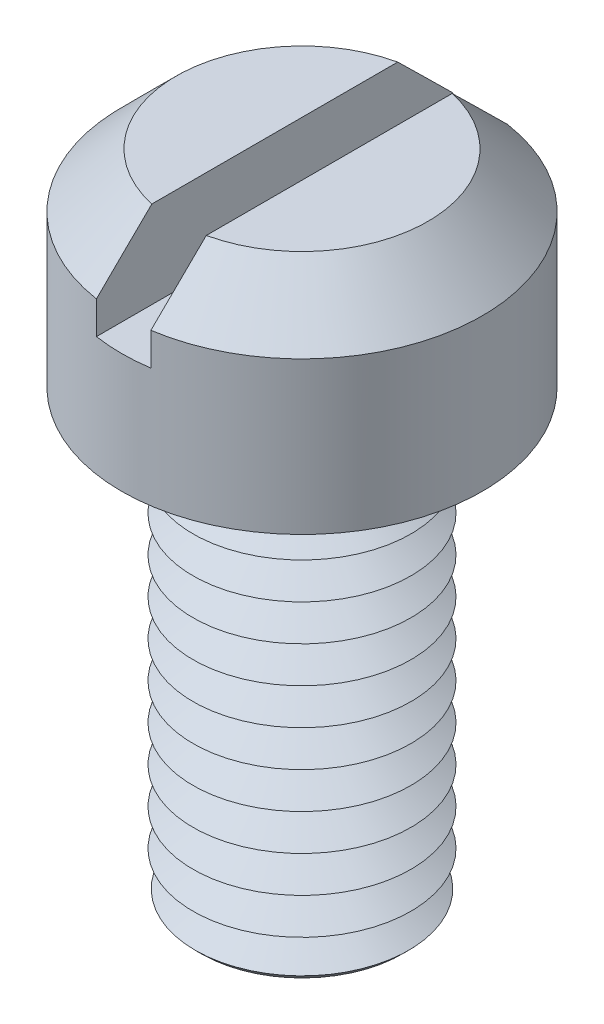
ISO-10303-21;
HEADER;
FILE_DESCRIPTION(('STEP AP214'),'2;1');
FILE_NAME('part.step','',(''),(''),'','','');
FILE_SCHEMA(('AUTOMOTIVE_DESIGN { 1 0 10303 214 1 1 1 1 }'));
ENDSEC;
DATA;
#1=APPLICATION_CONTEXT('core data for automotive mechanical design processes');
#2=APPLICATION_PROTOCOL_DEFINITION('international standard','automotive_design',2000,#1);
#3=PRODUCT_CONTEXT('',#1,'mechanical');
#4=PRODUCT('Part','Part','',(#3));
#5=PRODUCT_RELATED_PRODUCT_CATEGORY('part','',(#4));
#6=PRODUCT_DEFINITION_FORMATION('','',#4);
#7=PRODUCT_DEFINITION_CONTEXT('part definition',#1,'design');
#8=PRODUCT_DEFINITION('design','',#6,#7);
#9=PRODUCT_DEFINITION_SHAPE('','',#8);
#10=(LENGTH_UNIT() NAMED_UNIT(*) SI_UNIT(.MILLI.,.METRE.));
#11=(NAMED_UNIT(*) PLANE_ANGLE_UNIT() SI_UNIT($,.RADIAN.));
#12=(NAMED_UNIT(*) SI_UNIT($,.STERADIAN.) SOLID_ANGLE_UNIT());
#13=UNCERTAINTY_MEASURE_WITH_UNIT(LENGTH_MEASURE(1.E-05),#10,'distance_accuracy_value','');
#14=(GEOMETRIC_REPRESENTATION_CONTEXT(3) GLOBAL_UNCERTAINTY_ASSIGNED_CONTEXT((#13)) GLOBAL_UNIT_ASSIGNED_CONTEXT((#10,
#11,#12)) REPRESENTATION_CONTEXT('',''));
#15=CARTESIAN_POINT('',(0.,0.,0.));
#16=DIRECTION('',(0.,0.,1.));
#17=DIRECTION('',(1.,0.,0.));
#18=AXIS2_PLACEMENT_3D('',#15,#16,#17);
#19=CARTESIAN_POINT('',(0.880871999999996,1.444752,0.));
#20=DIRECTION('',(0.,1.,0.));
#21=DIRECTION('',(0.,0.,1.));
#22=AXIS2_PLACEMENT_3D('',#19,#20,#21);
#23=PLANE('',#22);
#24=DIRECTION('',(0.,0.,1.));
#25=VECTOR('',#24,1.);
#26=CARTESIAN_POINT('',(-0.1905,1.444752,-16.0764816511119));
#27=LINE('',#26,#25);
#28=CARTESIAN_POINT('',(-0.1905,1.444752,-0.860026296332847));
#29=VERTEX_POINT('',#28);
#30=CARTESIAN_POINT('',(-0.1905,1.444752,0.860026296332847));
#31=VERTEX_POINT('',#30);
#32=EDGE_CURVE('E86',#29,#31,#27,.T.);
#33=ORIENTED_EDGE('',*,*,#32,.F.);
#34=CARTESIAN_POINT('',(0.,1.444752,0.));
#35=DIRECTION('',(0.,-1.,0.));
#36=DIRECTION('',(0.,0.,-1.));
#37=AXIS2_PLACEMENT_3D('',#34,#35,#36);
#38=CIRCLE('',#37,0.880871999999996);
#39=EDGE_CURVE('E95',#31,#29,#38,.T.);
#40=ORIENTED_EDGE('',*,*,#39,.F.);
#41=EDGE_LOOP('',(#33,#40));
#42=FACE_BOUND('',#41,.T.);
#43=ADVANCED_FACE('F32',(#42),#23,.T.);
#44=CARTESIAN_POINT('',(0.,1.063752,0.));
#45=DIRECTION('',(0.,-1.,0.));
#46=DIRECTION('',(0.,0.,-1.));
#47=AXIS2_PLACEMENT_3D('',#44,#45,#46);
#48=CONICAL_SURFACE('',#47,1.261872,0.785398163397455);
#49=CARTESIAN_POINT('',(-0.1905,-0.467852623185187,-2.78697351876229));
#50=CARTESIAN_POINT('',(-0.1905,-0.371740082854874,-2.69063483874218));
#51=CARTESIAN_POINT('',(-0.1905,-0.275637399117228,-2.59428631466473));
#52=CARTESIAN_POINT('',(-0.1905,-0.0834624386961863,-2.40155440098031));
#53=CARTESIAN_POINT('',(-0.1905,0.0126098372138024,-2.3051710106022));
#54=CARTESIAN_POINT('',(-0.1905,0.204760774886571,-2.11230651513949));
#55=CARTESIAN_POINT('',(-0.1905,0.300839411910062,-2.01582538540597));
#56=CARTESIAN_POINT('',(-0.1905,0.492925197846268,-1.82279638627984));
#57=CARTESIAN_POINT('',(-0.1905,0.588932348356453,-1.72624851847759));
#58=CARTESIAN_POINT('',(-0.1905,0.781174131880335,-1.53269742629837));
#59=CARTESIAN_POINT('',(-0.1905,0.877408362403364,-1.4356938022126));
#60=CARTESIAN_POINT('',(-0.1905,1.06968632728043,-1.24148458714));
#61=CARTESIAN_POINT('',(-0.1905,1.1657300483249,-1.14427898295068));
#62=CARTESIAN_POINT('',(-0.1905,1.30946572978111,-0.998178595895962));
#63=CARTESIAN_POINT('',(-0.1905,1.35731451546988,-0.94943813306983));
#64=CARTESIAN_POINT('',(-0.1905,1.452847816913,-0.851793511017332));
#65=CARTESIAN_POINT('',(-0.1905,1.50053232819034,-0.802889347400097));
#66=CARTESIAN_POINT('',(-0.1905,1.59561548585213,-0.704816057706284));
#67=CARTESIAN_POINT('',(-0.1905,1.64301416722832,-0.6556469655179));
#68=CARTESIAN_POINT('',(-0.1905,1.73730670086978,-0.556827683778257));
#69=CARTESIAN_POINT('',(-0.1905,1.78420058313534,-0.507177523153933));
#70=CARTESIAN_POINT('',(-0.1905,1.84311872197408,-0.44333618835412));
#71=CARTESIAN_POINT('',(-0.1905,1.85567871539395,-0.429640631358191));
#72=CARTESIAN_POINT('',(-0.1905,1.88068026638353,-0.402141140539372));
#73=CARTESIAN_POINT('',(-0.1905,1.89312182039946,-0.388337203487076));
#74=CARTESIAN_POINT('',(-0.1905,1.93023876803364,-0.34669983128792));
#75=CARTESIAN_POINT('',(-0.1905,1.95468666777254,-0.318662068489018));
#76=CARTESIAN_POINT('',(-0.1905,1.99780726369237,-0.267088632360702));
#77=CARTESIAN_POINT('',(-0.1905,2.0166843364472,-0.243727705601058));
#78=CARTESIAN_POINT('',(-0.1905,2.04382713383034,-0.207795925782311));
#79=CARTESIAN_POINT('',(-0.1905,2.0526786384746,-0.195671219363639));
#80=CARTESIAN_POINT('',(-0.1905,2.06978239978055,-0.171009364845747));
#81=CARTESIAN_POINT('',(-0.1905,2.07803495870436,-0.158472429488246));
#82=CARTESIAN_POINT('',(-0.1905,2.09357374360952,-0.132891355377702));
#83=CARTESIAN_POINT('',(-0.1905,2.10086472451894,-0.119850159205719));
#84=CARTESIAN_POINT('',(-0.1905,2.11394801108239,-0.0930224341203741));
#85=CARTESIAN_POINT('',(-0.1905,2.11974244648433,-0.0792369985224974));
#86=CARTESIAN_POINT('',(-0.1905,2.12789755844528,-0.0539834572929784));
#87=CARTESIAN_POINT('',(-0.1905,2.13073382736757,-0.0426753846272729));
#88=CARTESIAN_POINT('',(-0.1905,2.13443330250219,-0.0197541392729509));
#89=CARTESIAN_POINT('',(-0.1905,2.13530223027439,-0.00814195093503864));
#90=CARTESIAN_POINT('',(-0.1905,2.13488284360986,0.0150669074323507));
#91=CARTESIAN_POINT('',(-0.1905,2.13358965136658,0.0266634831429294));
#92=CARTESIAN_POINT('',(-0.1905,2.12912122269932,0.0494949413611823));
#93=CARTESIAN_POINT('',(-0.1905,2.12594129340789,0.0607288480881517));
#94=CARTESIAN_POINT('',(-0.1905,2.11764355432097,0.0842906430777095));
#95=CARTESIAN_POINT('',(-0.1905,2.11231111853573,0.0965399148168696));
#96=CARTESIAN_POINT('',(-0.1905,2.10047062247971,0.120466218396629));
#97=CARTESIAN_POINT('',(-0.1905,2.09396013240869,0.132142002891485));
#98=CARTESIAN_POINT('',(-0.1905,2.08012181066479,0.15513217072478));
#99=CARTESIAN_POINT('',(-0.1905,2.07278723907617,0.1664424279402));
#100=CARTESIAN_POINT('',(-0.1905,2.05761083764235,0.18869648097471));
#101=CARTESIAN_POINT('',(-0.1905,2.0497695155635,0.199640627444946));
#102=CARTESIAN_POINT('',(-0.1905,2.0240870467418,0.234295618484728));
#103=CARTESIAN_POINT('',(-0.1905,2.00557686391405,0.257506873432943));
#104=CARTESIAN_POINT('',(-0.1905,1.96772808818959,0.303247770205183));
#105=CARTESIAN_POINT('',(-0.1905,1.94838901808858,0.325777006291657));
#106=CARTESIAN_POINT('',(-0.1905,1.90920204904368,0.370448767266621));
#107=CARTESIAN_POINT('',(-0.1905,1.88935342326154,0.392590654224217));
#108=CARTESIAN_POINT('',(-0.1905,1.849357449373,0.436603538248994));
#109=CARTESIAN_POINT('',(-0.1905,1.82921008396243,0.458474519488523));
#110=CARTESIAN_POINT('',(-0.1905,1.76867411875994,0.523605941585183));
#111=CARTESIAN_POINT('',(-0.1905,1.7279989891194,0.566599664221069));
#112=CARTESIAN_POINT('',(-0.1905,1.64630634339145,0.652179064601015));
#113=CARTESIAN_POINT('',(-0.1905,1.60528919422022,0.694765095016984));
#114=CARTESIAN_POINT('',(-0.1905,1.48062528473734,0.823537408540982));
#115=CARTESIAN_POINT('',(-0.1905,1.39663943833997,0.909395179579613));
#116=CARTESIAN_POINT('',(-0.1905,1.22831055112411,1.08076125334498));
#117=CARTESIAN_POINT('',(-0.1905,1.14396750329919,1.16626954915158));
#118=CARTESIAN_POINT('',(-0.1905,0.97504815331309,1.3371360598749));
#119=CARTESIAN_POINT('',(-0.1905,0.890471759299012,1.42249418407891));
#120=CARTESIAN_POINT('',(-0.1905,0.721209031224259,1.59309992339054));
#121=CARTESIAN_POINT('',(-0.1905,0.636522698009183,1.67834753933818));
#122=CARTESIAN_POINT('',(-0.1905,0.38199959253074,1.93435685604841));
#123=CARTESIAN_POINT('',(-0.1905,0.212062079716812,2.10501838986477));
#124=CARTESIAN_POINT('',(-0.1905,-0.127865722950066,2.4461133115385));
#125=CARTESIAN_POINT('',(-0.1905,-0.297855940232423,2.61654677170018));
#126=CARTESIAN_POINT('',(-0.1905,-0.467852623185187,2.78697351876229));
#127=B_SPLINE_CURVE_WITH_KNOTS('',3,(#49,#50,#51,#52,#53,#54,#55,#56,#57,#58,#59,#60,#61,#62,
#63,#64,#65,#66,#67,#68,#69,#70,#71,#72,#73,#74,#75,#76,#77,#78,#79,#80,#81,#82,#83,#84,#85,#86,
#87,#88,#89,#90,#91,#92,#93,#94,#95,#96,#97,#98,#99,#100,#101,#102,#103,#104,#105,#106,#107,
#108,#109,#110,#111,#112,#113,#114,#115,#116,#117,#118,#119,#120,#121,#122,#123,#124,#125,#126),
.UNSPECIFIED.,.F.,.F.,(4,2,2,2,2,2,2,2,2,2,2,2,2,2,2,2,2,2,2,2,2,2,2,2,2,2,2,2,2,2,2,2,2,2,2,2,
2,2,4),(0.,0.408250982112575,0.81651162552519,1.2249934536602,1.63346586193545,2.04338845827448,
2.45333874979418,2.65824408057358,2.86315495219124,3.06804020717027,3.27291321780224,
3.32866110441279,3.38441065849898,3.49599680772364,3.58605970327152,3.6310843329022,
3.67608608022715,3.72085621193336,3.76556227534564,3.80040171130422,3.83513969389775,
3.86995615220096,3.90485957441739,3.94484090250556,3.98490565421372,4.02532591276218,
4.06570627982171,4.15472209103738,4.24378985723537,4.33299263035048,4.42220059078114,
4.59975102371055,4.77713069623443,5.13744128581211,5.49775897583519,5.85824802150938,
6.21873431070841,6.94125546884615,7.66340351873644),.UNSPECIFIED.);
#128=CARTESIAN_POINT('',(-0.1905,1.063752,-1.24740959367162));
#129=VERTEX_POINT('',#128);
#130=EDGE_CURVE('E83',#129,#29,#127,.T.);
#131=ORIENTED_EDGE('',*,*,#130,.F.);
#132=CARTESIAN_POINT('',(0.,1.063752,0.));
#133=DIRECTION('',(0.,-1.,0.));
#134=DIRECTION('',(0.,0.,-1.));
#135=AXIS2_PLACEMENT_3D('',#132,#133,#134);
#136=CIRCLE('',#135,1.261872);
#137=CARTESIAN_POINT('',(-0.1905,1.063752,1.24740959367162));
#138=VERTEX_POINT('',#137);
#139=EDGE_CURVE('E101',#138,#129,#136,.T.);
#140=ORIENTED_EDGE('',*,*,#139,.F.);
#141=EDGE_CURVE('E92',#31,#138,#127,.T.);
#142=ORIENTED_EDGE('',*,*,#141,.F.);
#143=ORIENTED_EDGE('',*,*,#39,.T.);
#144=EDGE_LOOP('',(#131,#140,#142,#143));
#145=FACE_BOUND('',#144,.T.);
#146=ADVANCED_FACE('F97',(#145),#48,.T.);
#147=CARTESIAN_POINT('',(0.,-2.921,0.));
#148=DIRECTION('',(0.,-1.,0.));
#149=DIRECTION('',(0.,0.,-1.));
#150=AXIS2_PLACEMENT_3D('',#147,#148,#149);
#151=CONICAL_SURFACE('',#150,0.542029547438752,1.04719755119659);
#152=CARTESIAN_POINT('',(0.,-3.03870295474388,0.));
#153=DIRECTION('',(0.,-1.,0.));
#154=DIRECTION('',(0.,0.,-1.));
#155=AXIS2_PLACEMENT_3D('',#152,#153,#154);
#156=CIRCLE('',#155,0.745897045256123);
#157=CARTESIAN_POINT('',(0.,-3.03870295474388,-0.745897045256123));
#158=VERTEX_POINT('',#157);
#159=EDGE_CURVE('E187',#158,#158,#156,.F.);
#160=ORIENTED_EDGE('',*,*,#159,.T.);
#161=EDGE_LOOP('',(#160));
#162=FACE_BOUND('',#161,.T.);
#163=CARTESIAN_POINT('',(0.,-2.921,0.));
#164=DIRECTION('',(0.,-1.,0.));
#165=DIRECTION('',(0.,0.,-1.));
#166=AXIS2_PLACEMENT_3D('',#163,#164,#165);
#167=CIRCLE('',#166,0.542029547438752);
#168=CARTESIAN_POINT('',(0.,-2.921,-0.542029547438752));
#169=VERTEX_POINT('',#168);
#170=EDGE_CURVE('E181',#169,#169,#167,.T.);
#171=ORIENTED_EDGE('',*,*,#170,.T.);
#172=EDGE_LOOP('',(#171));
#173=FACE_BOUND('',#172,.T.);
#174=ADVANCED_FACE('F225',(#162,#173),#151,.T.);
#175=CARTESIAN_POINT('',(0.,-2.794,0.));
#176=DIRECTION('',(0.,1.,0.));
#177=DIRECTION('',(0.,0.,1.));
#178=AXIS2_PLACEMENT_3D('',#175,#176,#177);
#179=CONICAL_SURFACE('',#178,0.761999999999999,1.04719755119661);
#180=ORIENTED_EDGE('',*,*,#170,.F.);
#181=EDGE_LOOP('',(#180));
#182=FACE_BOUND('',#181,.T.);
#183=CARTESIAN_POINT('',(0.,-2.794,0.));
#184=DIRECTION('',(0.,-1.,0.));
#185=DIRECTION('',(0.,0.,-1.));
#186=AXIS2_PLACEMENT_3D('',#183,#184,#185);
#187=CIRCLE('',#186,0.761999999999999);
#188=CARTESIAN_POINT('',(0.,-2.794,-0.761999999999999));
#189=VERTEX_POINT('',#188);
#190=EDGE_CURVE('E178',#189,#189,#187,.T.);
#191=ORIENTED_EDGE('',*,*,#190,.T.);
#192=EDGE_LOOP('',(#191));
#193=FACE_BOUND('',#192,.T.);
#194=ADVANCED_FACE('F549',(#182,#193),#179,.T.);
#195=CARTESIAN_POINT('',(0.,-2.667,0.));
#196=DIRECTION('',(0.,-1.,0.));
#197=DIRECTION('',(0.,0.,-1.));
#198=AXIS2_PLACEMENT_3D('',#195,#196,#197);
#199=CONICAL_SURFACE('',#198,0.542029547438752,1.04719755119659);
#200=ORIENTED_EDGE('',*,*,#190,.F.);
#201=EDGE_LOOP('',(#200));
#202=FACE_BOUND('',#201,.T.);
#203=CARTESIAN_POINT('',(0.,-2.667,0.));
#204=DIRECTION('',(0.,-1.,0.));
#205=DIRECTION('',(0.,0.,-1.));
#206=AXIS2_PLACEMENT_3D('',#203,#204,#205);
#207=CIRCLE('',#206,0.542029547438752);
#208=CARTESIAN_POINT('',(0.,-2.667,-0.542029547438752));
#209=VERTEX_POINT('',#208);
#210=EDGE_CURVE('E175',#209,#209,#207,.T.);
#211=ORIENTED_EDGE('',*,*,#210,.T.);
#212=EDGE_LOOP('',(#211));
#213=FACE_BOUND('',#212,.T.);
#214=ADVANCED_FACE('F539',(#202,#213),#199,.T.);
#215=CARTESIAN_POINT('',(0.,-2.54,0.));
#216=DIRECTION('',(0.,1.,0.));
#217=DIRECTION('',(0.,0.,1.));
#218=AXIS2_PLACEMENT_3D('',#215,#216,#217);
#219=CONICAL_SURFACE('',#218,0.761999999999999,1.04719755119659);
#220=ORIENTED_EDGE('',*,*,#210,.F.);
#221=EDGE_LOOP('',(#220));
#222=FACE_BOUND('',#221,.T.);
#223=CARTESIAN_POINT('',(0.,-2.54,0.));
#224=DIRECTION('',(0.,-1.,0.));
#225=DIRECTION('',(0.,0.,-1.));
#226=AXIS2_PLACEMENT_3D('',#223,#224,#225);
#227=CIRCLE('',#226,0.761999999999999);
#228=CARTESIAN_POINT('',(0.,-2.54,-0.761999999999999));
#229=VERTEX_POINT('',#228);
#230=EDGE_CURVE('E172',#229,#229,#227,.T.);
#231=ORIENTED_EDGE('',*,*,#230,.T.);
#232=EDGE_LOOP('',(#231));
#233=FACE_BOUND('',#232,.T.);
#234=ADVANCED_FACE('F529',(#222,#233),#219,.T.);
#235=CARTESIAN_POINT('',(0.,-2.413,0.));
#236=DIRECTION('',(0.,-1.,0.));
#237=DIRECTION('',(0.,0.,-1.));
#238=AXIS2_PLACEMENT_3D('',#235,#236,#237);
#239=CONICAL_SURFACE('',#238,0.542029547438752,1.04719755119659);
#240=ORIENTED_EDGE('',*,*,#230,.F.);
#241=EDGE_LOOP('',(#240));
#242=FACE_BOUND('',#241,.T.);
#243=CARTESIAN_POINT('',(0.,-2.413,0.));
#244=DIRECTION('',(0.,-1.,0.));
#245=DIRECTION('',(0.,0.,-1.));
#246=AXIS2_PLACEMENT_3D('',#243,#244,#245);
#247=CIRCLE('',#246,0.542029547438752);
#248=CARTESIAN_POINT('',(0.,-2.413,-0.542029547438752));
#249=VERTEX_POINT('',#248);
#250=EDGE_CURVE('E169',#249,#249,#247,.T.);
#251=ORIENTED_EDGE('',*,*,#250,.T.);
#252=EDGE_LOOP('',(#251));
#253=FACE_BOUND('',#252,.T.);
#254=ADVANCED_FACE('F519',(#242,#253),#239,.T.);
#255=CARTESIAN_POINT('',(0.,-2.286,0.));
#256=DIRECTION('',(0.,1.,0.));
#257=DIRECTION('',(0.,0.,1.));
#258=AXIS2_PLACEMENT_3D('',#255,#256,#257);
#259=CONICAL_SURFACE('',#258,0.761999999999999,1.04719755119661);
#260=ORIENTED_EDGE('',*,*,#250,.F.);
#261=EDGE_LOOP('',(#260));
#262=FACE_BOUND('',#261,.T.);
#263=CARTESIAN_POINT('',(0.,-2.286,0.));
#264=DIRECTION('',(0.,-1.,0.));
#265=DIRECTION('',(0.,0.,-1.));
#266=AXIS2_PLACEMENT_3D('',#263,#264,#265);
#267=CIRCLE('',#266,0.761999999999999);
#268=CARTESIAN_POINT('',(0.,-2.286,-0.761999999999999));
#269=VERTEX_POINT('',#268);
#270=EDGE_CURVE('E166',#269,#269,#267,.T.);
#271=ORIENTED_EDGE('',*,*,#270,.T.);
#272=EDGE_LOOP('',(#271));
#273=FACE_BOUND('',#272,.T.);
#274=ADVANCED_FACE('F509',(#262,#273),#259,.T.);
#275=CARTESIAN_POINT('',(0.,-2.159,0.));
#276=DIRECTION('',(0.,-1.,0.));
#277=DIRECTION('',(0.,0.,-1.));
#278=AXIS2_PLACEMENT_3D('',#275,#276,#277);
#279=CONICAL_SURFACE('',#278,0.542029547438752,1.04719755119659);
#280=ORIENTED_EDGE('',*,*,#270,.F.);
#281=EDGE_LOOP('',(#280));
#282=FACE_BOUND('',#281,.T.);
#283=CARTESIAN_POINT('',(0.,-2.159,0.));
#284=DIRECTION('',(0.,-1.,0.));
#285=DIRECTION('',(0.,0.,-1.));
#286=AXIS2_PLACEMENT_3D('',#283,#284,#285);
#287=CIRCLE('',#286,0.542029547438752);
#288=CARTESIAN_POINT('',(0.,-2.159,-0.542029547438752));
#289=VERTEX_POINT('',#288);
#290=EDGE_CURVE('E163',#289,#289,#287,.T.);
#291=ORIENTED_EDGE('',*,*,#290,.T.);
#292=EDGE_LOOP('',(#291));
#293=FACE_BOUND('',#292,.T.);
#294=ADVANCED_FACE('F499',(#282,#293),#279,.T.);
#295=CARTESIAN_POINT('',(0.,-2.032,0.));
#296=DIRECTION('',(0.,1.,0.));
#297=DIRECTION('',(0.,0.,1.));
#298=AXIS2_PLACEMENT_3D('',#295,#296,#297);
#299=CONICAL_SURFACE('',#298,0.761999999999999,1.04719755119659);
#300=ORIENTED_EDGE('',*,*,#290,.F.);
#301=EDGE_LOOP('',(#300));
#302=FACE_BOUND('',#301,.T.);
#303=CARTESIAN_POINT('',(0.,-2.032,0.));
#304=DIRECTION('',(0.,-1.,0.));
#305=DIRECTION('',(0.,0.,-1.));
#306=AXIS2_PLACEMENT_3D('',#303,#304,#305);
#307=CIRCLE('',#306,0.761999999999999);
#308=CARTESIAN_POINT('',(0.,-2.032,-0.761999999999999));
#309=VERTEX_POINT('',#308);
#310=EDGE_CURVE('E160',#309,#309,#307,.T.);
#311=ORIENTED_EDGE('',*,*,#310,.T.);
#312=EDGE_LOOP('',(#311));
#313=FACE_BOUND('',#312,.T.);
#314=ADVANCED_FACE('F489',(#302,#313),#299,.T.);
#315=CARTESIAN_POINT('',(0.,-1.905,0.));
#316=DIRECTION('',(0.,-1.,0.));
#317=DIRECTION('',(0.,0.,-1.));
#318=AXIS2_PLACEMENT_3D('',#315,#316,#317);
#319=CONICAL_SURFACE('',#318,0.542029547438752,1.04719755119661);
#320=ORIENTED_EDGE('',*,*,#310,.F.);
#321=EDGE_LOOP('',(#320));
#322=FACE_BOUND('',#321,.T.);
#323=CARTESIAN_POINT('',(0.,-1.905,0.));
#324=DIRECTION('',(0.,-1.,0.));
#325=DIRECTION('',(0.,0.,-1.));
#326=AXIS2_PLACEMENT_3D('',#323,#324,#325);
#327=CIRCLE('',#326,0.542029547438752);
#328=CARTESIAN_POINT('',(0.,-1.905,-0.542029547438752));
#329=VERTEX_POINT('',#328);
#330=EDGE_CURVE('E157',#329,#329,#327,.T.);
#331=ORIENTED_EDGE('',*,*,#330,.T.);
#332=EDGE_LOOP('',(#331));
#333=FACE_BOUND('',#332,.T.);
#334=ADVANCED_FACE('F479',(#322,#333),#319,.T.);
#335=CARTESIAN_POINT('',(0.,-1.778,0.));
#336=DIRECTION('',(0.,1.,0.));
#337=DIRECTION('',(0.,0.,1.));
#338=AXIS2_PLACEMENT_3D('',#335,#336,#337);
#339=CONICAL_SURFACE('',#338,0.761999999999999,1.04719755119659);
#340=ORIENTED_EDGE('',*,*,#330,.F.);
#341=EDGE_LOOP('',(#340));
#342=FACE_BOUND('',#341,.T.);
#343=CARTESIAN_POINT('',(0.,-1.778,0.));
#344=DIRECTION('',(0.,-1.,0.));
#345=DIRECTION('',(0.,0.,-1.));
#346=AXIS2_PLACEMENT_3D('',#343,#344,#345);
#347=CIRCLE('',#346,0.761999999999999);
#348=CARTESIAN_POINT('',(0.,-1.778,-0.761999999999999));
#349=VERTEX_POINT('',#348);
#350=EDGE_CURVE('E154',#349,#349,#347,.T.);
#351=ORIENTED_EDGE('',*,*,#350,.T.);
#352=EDGE_LOOP('',(#351));
#353=FACE_BOUND('',#352,.T.);
#354=ADVANCED_FACE('F469',(#342,#353),#339,.T.);
#355=CARTESIAN_POINT('',(0.,-1.651,0.));
#356=DIRECTION('',(0.,-1.,0.));
#357=DIRECTION('',(0.,0.,-1.));
#358=AXIS2_PLACEMENT_3D('',#355,#356,#357);
#359=CONICAL_SURFACE('',#358,0.542029547438752,1.04719755119659);
#360=ORIENTED_EDGE('',*,*,#350,.F.);
#361=EDGE_LOOP('',(#360));
#362=FACE_BOUND('',#361,.T.);
#363=CARTESIAN_POINT('',(0.,-1.651,0.));
#364=DIRECTION('',(0.,-1.,0.));
#365=DIRECTION('',(0.,0.,-1.));
#366=AXIS2_PLACEMENT_3D('',#363,#364,#365);
#367=CIRCLE('',#366,0.542029547438752);
#368=CARTESIAN_POINT('',(0.,-1.651,-0.542029547438752));
#369=VERTEX_POINT('',#368);
#370=EDGE_CURVE('E151',#369,#369,#367,.T.);
#371=ORIENTED_EDGE('',*,*,#370,.T.);
#372=EDGE_LOOP('',(#371));
#373=FACE_BOUND('',#372,.T.);
#374=ADVANCED_FACE('F459',(#362,#373),#359,.T.);
#375=CARTESIAN_POINT('',(0.,-1.524,0.));
#376=DIRECTION('',(0.,1.,0.));
#377=DIRECTION('',(0.,0.,1.));
#378=AXIS2_PLACEMENT_3D('',#375,#376,#377);
#379=CONICAL_SURFACE('',#378,0.761999999999999,1.04719755119659);
#380=ORIENTED_EDGE('',*,*,#370,.F.);
#381=EDGE_LOOP('',(#380));
#382=FACE_BOUND('',#381,.T.);
#383=CARTESIAN_POINT('',(0.,-1.524,0.));
#384=DIRECTION('',(0.,-1.,0.));
#385=DIRECTION('',(0.,0.,-1.));
#386=AXIS2_PLACEMENT_3D('',#383,#384,#385);
#387=CIRCLE('',#386,0.761999999999999);
#388=CARTESIAN_POINT('',(0.,-1.524,-0.761999999999999));
#389=VERTEX_POINT('',#388);
#390=EDGE_CURVE('E148',#389,#389,#387,.T.);
#391=ORIENTED_EDGE('',*,*,#390,.T.);
#392=EDGE_LOOP('',(#391));
#393=FACE_BOUND('',#392,.T.);
#394=ADVANCED_FACE('F449',(#382,#393),#379,.T.);
#395=CARTESIAN_POINT('',(0.,-1.397,0.));
#396=DIRECTION('',(0.,-1.,0.));
#397=DIRECTION('',(0.,0.,-1.));
#398=AXIS2_PLACEMENT_3D('',#395,#396,#397);
#399=CONICAL_SURFACE('',#398,0.542029547438752,1.04719755119661);
#400=ORIENTED_EDGE('',*,*,#390,.F.);
#401=EDGE_LOOP('',(#400));
#402=FACE_BOUND('',#401,.T.);
#403=CARTESIAN_POINT('',(0.,-1.397,0.));
#404=DIRECTION('',(0.,-1.,0.));
#405=DIRECTION('',(0.,0.,-1.));
#406=AXIS2_PLACEMENT_3D('',#403,#404,#405);
#407=CIRCLE('',#406,0.542029547438752);
#408=CARTESIAN_POINT('',(0.,-1.397,-0.542029547438752));
#409=VERTEX_POINT('',#408);
#410=EDGE_CURVE('E145',#409,#409,#407,.T.);
#411=ORIENTED_EDGE('',*,*,#410,.T.);
#412=EDGE_LOOP('',(#411));
#413=FACE_BOUND('',#412,.T.);
#414=ADVANCED_FACE('F439',(#402,#413),#399,.T.);
#415=CARTESIAN_POINT('',(0.,-1.27,0.));
#416=DIRECTION('',(0.,1.,0.));
#417=DIRECTION('',(0.,0.,1.));
#418=AXIS2_PLACEMENT_3D('',#415,#416,#417);
#419=CONICAL_SURFACE('',#418,0.761999999999999,1.04719755119659);
#420=ORIENTED_EDGE('',*,*,#410,.F.);
#421=EDGE_LOOP('',(#420));
#422=FACE_BOUND('',#421,.T.);
#423=CARTESIAN_POINT('',(0.,-1.27,0.));
#424=DIRECTION('',(0.,-1.,0.));
#425=DIRECTION('',(0.,0.,-1.));
#426=AXIS2_PLACEMENT_3D('',#423,#424,#425);
#427=CIRCLE('',#426,0.761999999999999);
#428=CARTESIAN_POINT('',(0.,-1.27,-0.761999999999999));
#429=VERTEX_POINT('',#428);
#430=EDGE_CURVE('E142',#429,#429,#427,.T.);
#431=ORIENTED_EDGE('',*,*,#430,.T.);
#432=EDGE_LOOP('',(#431));
#433=FACE_BOUND('',#432,.T.);
#434=ADVANCED_FACE('F429',(#422,#433),#419,.T.);
#435=CARTESIAN_POINT('',(0.,-1.143,0.));
#436=DIRECTION('',(0.,-1.,0.));
#437=DIRECTION('',(0.,0.,-1.));
#438=AXIS2_PLACEMENT_3D('',#435,#436,#437);
#439=CONICAL_SURFACE('',#438,0.542029547438752,1.04719755119659);
#440=ORIENTED_EDGE('',*,*,#430,.F.);
#441=EDGE_LOOP('',(#440));
#442=FACE_BOUND('',#441,.T.);
#443=CARTESIAN_POINT('',(0.,-1.143,0.));
#444=DIRECTION('',(0.,-1.,0.));
#445=DIRECTION('',(0.,0.,-1.));
#446=AXIS2_PLACEMENT_3D('',#443,#444,#445);
#447=CIRCLE('',#446,0.542029547438752);
#448=CARTESIAN_POINT('',(0.,-1.143,-0.542029547438752));
#449=VERTEX_POINT('',#448);
#450=EDGE_CURVE('E139',#449,#449,#447,.T.);
#451=ORIENTED_EDGE('',*,*,#450,.T.);
#452=EDGE_LOOP('',(#451));
#453=FACE_BOUND('',#452,.T.);
#454=ADVANCED_FACE('F419',(#442,#453),#439,.T.);
#455=CARTESIAN_POINT('',(0.,-1.016,0.));
#456=DIRECTION('',(0.,1.,0.));
#457=DIRECTION('',(0.,0.,1.));
#458=AXIS2_PLACEMENT_3D('',#455,#456,#457);
#459=CONICAL_SURFACE('',#458,0.761999999999999,1.04719755119661);
#460=ORIENTED_EDGE('',*,*,#450,.F.);
#461=EDGE_LOOP('',(#460));
#462=FACE_BOUND('',#461,.T.);
#463=CARTESIAN_POINT('',(0.,-1.016,0.));
#464=DIRECTION('',(0.,-1.,0.));
#465=DIRECTION('',(0.,0.,-1.));
#466=AXIS2_PLACEMENT_3D('',#463,#464,#465);
#467=CIRCLE('',#466,0.761999999999999);
#468=CARTESIAN_POINT('',(0.,-1.016,-0.761999999999999));
#469=VERTEX_POINT('',#468);
#470=EDGE_CURVE('E136',#469,#469,#467,.T.);
#471=ORIENTED_EDGE('',*,*,#470,.T.);
#472=EDGE_LOOP('',(#471));
#473=FACE_BOUND('',#472,.T.);
#474=ADVANCED_FACE('F409',(#462,#473),#459,.T.);
#475=CARTESIAN_POINT('',(0.,-0.889000000000001,0.));
#476=DIRECTION('',(0.,-1.,0.));
#477=DIRECTION('',(0.,0.,-1.));
#478=AXIS2_PLACEMENT_3D('',#475,#476,#477);
#479=CONICAL_SURFACE('',#478,0.542029547438752,1.04719755119659);
#480=ORIENTED_EDGE('',*,*,#470,.F.);
#481=EDGE_LOOP('',(#480));
#482=FACE_BOUND('',#481,.T.);
#483=CARTESIAN_POINT('',(0.,-0.889000000000001,0.));
#484=DIRECTION('',(0.,-1.,0.));
#485=DIRECTION('',(0.,0.,-1.));
#486=AXIS2_PLACEMENT_3D('',#483,#484,#485);
#487=CIRCLE('',#486,0.542029547438752);
#488=CARTESIAN_POINT('',(0.,-0.889000000000001,-0.542029547438752));
#489=VERTEX_POINT('',#488);
#490=EDGE_CURVE('E133',#489,#489,#487,.T.);
#491=ORIENTED_EDGE('',*,*,#490,.T.);
#492=EDGE_LOOP('',(#491));
#493=FACE_BOUND('',#492,.T.);
#494=ADVANCED_FACE('F399',(#482,#493),#479,.T.);
#495=CARTESIAN_POINT('',(0.,-0.761999999999999,0.));
#496=DIRECTION('',(0.,1.,0.));
#497=DIRECTION('',(0.,0.,1.));
#498=AXIS2_PLACEMENT_3D('',#495,#496,#497);
#499=CONICAL_SURFACE('',#498,0.761999999999999,1.04719755119659);
#500=ORIENTED_EDGE('',*,*,#490,.F.);
#501=EDGE_LOOP('',(#500));
#502=FACE_BOUND('',#501,.T.);
#503=CARTESIAN_POINT('',(0.,-0.761999999999999,0.));
#504=DIRECTION('',(0.,-1.,0.));
#505=DIRECTION('',(0.,0.,-1.));
#506=AXIS2_PLACEMENT_3D('',#503,#504,#505);
#507=CIRCLE('',#506,0.761999999999999);
#508=CARTESIAN_POINT('',(0.,-0.761999999999999,-0.761999999999999));
#509=VERTEX_POINT('',#508);
#510=EDGE_CURVE('E130',#509,#509,#507,.T.);
#511=ORIENTED_EDGE('',*,*,#510,.T.);
#512=EDGE_LOOP('',(#511));
#513=FACE_BOUND('',#512,.T.);
#514=ADVANCED_FACE('F389',(#502,#513),#499,.T.);
#515=CARTESIAN_POINT('',(0.,-0.634999999999997,0.));
#516=DIRECTION('',(0.,-1.,0.));
#517=DIRECTION('',(0.,0.,-1.));
#518=AXIS2_PLACEMENT_3D('',#515,#516,#517);
#519=CONICAL_SURFACE('',#518,0.542029547438752,1.04719755119659);
#520=ORIENTED_EDGE('',*,*,#510,.F.);
#521=EDGE_LOOP('',(#520));
#522=FACE_BOUND('',#521,.T.);
#523=CARTESIAN_POINT('',(0.,-0.634999999999997,0.));
#524=DIRECTION('',(0.,-1.,0.));
#525=DIRECTION('',(0.,0.,-1.));
#526=AXIS2_PLACEMENT_3D('',#523,#524,#525);
#527=CIRCLE('',#526,0.542029547438752);
#528=CARTESIAN_POINT('',(0.,-0.634999999999997,-0.542029547438752));
#529=VERTEX_POINT('',#528);
#530=EDGE_CURVE('E127',#529,#529,#527,.T.);
#531=ORIENTED_EDGE('',*,*,#530,.T.);
#532=EDGE_LOOP('',(#531));
#533=FACE_BOUND('',#532,.T.);
#534=ADVANCED_FACE('F379',(#522,#533),#519,.T.);
#535=CARTESIAN_POINT('',(0.,-0.508000000000002,0.));
#536=DIRECTION('',(0.,1.,0.));
#537=DIRECTION('',(0.,0.,1.));
#538=AXIS2_PLACEMENT_3D('',#535,#536,#537);
#539=CONICAL_SURFACE('',#538,0.761999999999999,1.04719755119661);
#540=ORIENTED_EDGE('',*,*,#530,.F.);
#541=EDGE_LOOP('',(#540));
#542=FACE_BOUND('',#541,.T.);
#543=CARTESIAN_POINT('',(0.,-0.508000000000002,0.));
#544=DIRECTION('',(0.,-1.,0.));
#545=DIRECTION('',(0.,0.,-1.));
#546=AXIS2_PLACEMENT_3D('',#543,#544,#545);
#547=CIRCLE('',#546,0.761999999999999);
#548=CARTESIAN_POINT('',(0.,-0.508000000000002,-0.761999999999999));
#549=VERTEX_POINT('',#548);
#550=EDGE_CURVE('E124',#549,#549,#547,.T.);
#551=ORIENTED_EDGE('',*,*,#550,.T.);
#552=EDGE_LOOP('',(#551));
#553=FACE_BOUND('',#552,.T.);
#554=ADVANCED_FACE('F369',(#542,#553),#539,.T.);
#555=CARTESIAN_POINT('',(0.,-0.380999999999999,0.));
#556=DIRECTION('',(0.,-1.,0.));
#557=DIRECTION('',(0.,0.,-1.));
#558=AXIS2_PLACEMENT_3D('',#555,#556,#557);
#559=CONICAL_SURFACE('',#558,0.542029547438752,1.04719755119659);
#560=ORIENTED_EDGE('',*,*,#550,.F.);
#561=EDGE_LOOP('',(#560));
#562=FACE_BOUND('',#561,.T.);
#563=CARTESIAN_POINT('',(0.,-0.380999999999999,0.));
#564=DIRECTION('',(0.,-1.,0.));
#565=DIRECTION('',(0.,0.,-1.));
#566=AXIS2_PLACEMENT_3D('',#563,#564,#565);
#567=CIRCLE('',#566,0.542029547438752);
#568=CARTESIAN_POINT('',(0.,-0.380999999999999,-0.542029547438752));
#569=VERTEX_POINT('',#568);
#570=EDGE_CURVE('E121',#569,#569,#567,.T.);
#571=ORIENTED_EDGE('',*,*,#570,.T.);
#572=EDGE_LOOP('',(#571));
#573=FACE_BOUND('',#572,.T.);
#574=ADVANCED_FACE('F359',(#562,#573),#559,.T.);
#575=CARTESIAN_POINT('',(0.,-0.253999999999997,0.));
#576=DIRECTION('',(0.,1.,0.));
#577=DIRECTION('',(0.,0.,1.));
#578=AXIS2_PLACEMENT_3D('',#575,#576,#577);
#579=CONICAL_SURFACE('',#578,0.761999999999999,1.04719755119659);
#580=ORIENTED_EDGE('',*,*,#570,.F.);
#581=EDGE_LOOP('',(#580));
#582=FACE_BOUND('',#581,.T.);
#583=CARTESIAN_POINT('',(0.,-0.253999999999997,0.));
#584=DIRECTION('',(0.,-1.,0.));
#585=DIRECTION('',(0.,0.,-1.));
#586=AXIS2_PLACEMENT_3D('',#583,#584,#585);
#587=CIRCLE('',#586,0.761999999999999);
#588=CARTESIAN_POINT('',(0.,-0.253999999999997,-0.761999999999999));
#589=VERTEX_POINT('',#588);
#590=EDGE_CURVE('E118',#589,#589,#587,.T.);
#591=ORIENTED_EDGE('',*,*,#590,.T.);
#592=EDGE_LOOP('',(#591));
#593=FACE_BOUND('',#592,.T.);
#594=ADVANCED_FACE('F349',(#582,#593),#579,.T.);
#595=CARTESIAN_POINT('',(0.,-0.127000000000002,0.));
#596=DIRECTION('',(0.,-1.,0.));
#597=DIRECTION('',(0.,0.,-1.));
#598=AXIS2_PLACEMENT_3D('',#595,#596,#597);
#599=CONICAL_SURFACE('',#598,0.542029547438752,1.04719755119661);
#600=ORIENTED_EDGE('',*,*,#590,.F.);
#601=EDGE_LOOP('',(#600));
#602=FACE_BOUND('',#601,.T.);
#603=CARTESIAN_POINT('',(0.,-0.127000000000002,0.));
#604=DIRECTION('',(0.,-1.,0.));
#605=DIRECTION('',(0.,0.,-1.));
#606=AXIS2_PLACEMENT_3D('',#603,#604,#605);
#607=CIRCLE('',#606,0.542029547438752);
#608=CARTESIAN_POINT('',(0.,-0.127000000000002,-0.542029547438752));
#609=VERTEX_POINT('',#608);
#610=EDGE_CURVE('E115',#609,#609,#607,.T.);
#611=ORIENTED_EDGE('',*,*,#610,.T.);
#612=EDGE_LOOP('',(#611));
#613=FACE_BOUND('',#612,.T.);
#614=ADVANCED_FACE('F340',(#602,#613),#599,.T.);
#615=CARTESIAN_POINT('',(0.,0.,0.));
#616=DIRECTION('',(0.,1.,0.));
#617=DIRECTION('',(0.,0.,1.));
#618=AXIS2_PLACEMENT_3D('',#615,#616,#617);
#619=CONICAL_SURFACE('',#618,0.761999999999999,1.04719755119659);
#620=ORIENTED_EDGE('',*,*,#610,.F.);
#621=EDGE_LOOP('',(#620));
#622=FACE_BOUND('',#621,.T.);
#623=CARTESIAN_POINT('',(0.,0.,0.));
#624=DIRECTION('',(0.,-1.,0.));
#625=DIRECTION('',(0.,0.,-1.));
#626=AXIS2_PLACEMENT_3D('',#623,#624,#625);
#627=CIRCLE('',#626,0.761999999999999);
#628=CARTESIAN_POINT('',(0.,0.,-0.761999999999999));
#629=VERTEX_POINT('',#628);
#630=EDGE_CURVE('E112',#629,#629,#627,.T.);
#631=ORIENTED_EDGE('',*,*,#630,.T.);
#632=EDGE_LOOP('',(#631));
#633=FACE_BOUND('',#632,.T.);
#634=ADVANCED_FACE('F331',(#622,#633),#619,.T.);
#635=CARTESIAN_POINT('',(0.,-3.175,0.));
#636=DIRECTION('',(0.,1.,0.));
#637=DIRECTION('',(0.,0.,1.));
#638=AXIS2_PLACEMENT_3D('',#635,#636,#637);
#639=CONICAL_SURFACE('',#638,0.6096,0.785398163397456);
#640=CARTESIAN_POINT('',(0.,-3.08269704525613,0.));
#641=DIRECTION('',(0.,1.,0.));
#642=DIRECTION('',(0.,0.,1.));
#643=AXIS2_PLACEMENT_3D('',#640,#641,#642);
#644=CIRCLE('',#643,0.701902954743868);
#645=CARTESIAN_POINT('',(0.,-3.08269704525613,0.701902954743868));
#646=VERTEX_POINT('',#645);
#647=EDGE_CURVE('E190',#646,#646,#644,.F.);
#648=ORIENTED_EDGE('',*,*,#647,.F.);
#649=EDGE_LOOP('',(#648));
#650=FACE_BOUND('',#649,.T.);
#651=ORIENTED_EDGE('',*,*,#159,.F.);
#652=EDGE_LOOP('',(#651));
#653=FACE_BOUND('',#652,.T.);
#654=ADVANCED_FACE('F321',(#650,#653),#639,.T.);
#655=CARTESIAN_POINT('',(0.,-3.048,0.));
#656=DIRECTION('',(0.,1.,0.));
#657=DIRECTION('',(0.,0.,1.));
#658=AXIS2_PLACEMENT_3D('',#655,#656,#657);
#659=CONICAL_SURFACE('',#658,0.761999999999999,1.04719755119659);
#660=ORIENTED_EDGE('',*,*,#647,.T.);
#661=EDGE_LOOP('',(#660));
#662=FACE_BOUND('',#661,.T.);
#663=CARTESIAN_POINT('',(0.,-3.175,0.));
#664=DIRECTION('',(0.,-1.,0.));
#665=DIRECTION('',(0.,0.,-1.));
#666=AXIS2_PLACEMENT_3D('',#663,#664,#665);
#667=CIRCLE('',#666,0.542029547438752);
#668=CARTESIAN_POINT('',(0.,-3.175,-0.542029547438752));
#669=VERTEX_POINT('',#668);
#670=EDGE_CURVE('E184',#669,#669,#667,.T.);
#671=ORIENTED_EDGE('',*,*,#670,.F.);
#672=EDGE_LOOP('',(#671));
#673=FACE_BOUND('',#672,.T.);
#674=ADVANCED_FACE('F312',(#662,#673),#659,.T.);
#675=CARTESIAN_POINT('',(0.,-3.175,0.));
#676=DIRECTION('',(0.,-1.,0.));
#677=DIRECTION('',(0.,0.,-1.));
#678=AXIS2_PLACEMENT_3D('',#675,#676,#677);
#679=PLANE('',#678);
#680=ORIENTED_EDGE('',*,*,#670,.T.);
#681=EDGE_LOOP('',(#680));
#682=FACE_BOUND('',#681,.T.);
#683=ADVANCED_FACE('F34',(#682),#679,.T.);
#684=CARTESIAN_POINT('',(0.,0.,0.));
#685=DIRECTION('',(0.,-1.,0.));
#686=DIRECTION('',(0.,0.,-1.));
#687=AXIS2_PLACEMENT_3D('',#684,#685,#686);
#688=PLANE('',#687);
#689=CARTESIAN_POINT('',(0.,0.,0.));
#690=DIRECTION('',(0.,-1.,0.));
#691=DIRECTION('',(0.,0.,-1.));
#692=AXIS2_PLACEMENT_3D('',#689,#690,#691);
#693=CIRCLE('',#692,1.261872);
#694=CARTESIAN_POINT('',(0.,0.,-1.261872));
#695=VERTEX_POINT('',#694);
#696=EDGE_CURVE('E109',#695,#695,#693,.T.);
#697=ORIENTED_EDGE('',*,*,#696,.T.);
#698=EDGE_LOOP('',(#697));
#699=FACE_BOUND('',#698,.T.);
#700=ORIENTED_EDGE('',*,*,#630,.F.);
#701=EDGE_LOOP('',(#700));
#702=FACE_BOUND('',#701,.T.);
#703=ADVANCED_FACE('F229',(#699,#702),#688,.T.);
#704=DIRECTION('',(0.,0.,-1.));
#705=VECTOR('',#704,1.);
#706=CARTESIAN_POINT('',(0.1905,1.444752,-16.0764816511119));
#707=LINE('',#706,#705);
#708=CARTESIAN_POINT('',(0.1905,1.444752,0.860026296332847));
#709=VERTEX_POINT('',#708);
#710=CARTESIAN_POINT('',(0.1905,1.444752,-0.860026296332846));
#711=VERTEX_POINT('',#710);
#712=EDGE_CURVE('E47',#709,#711,#707,.T.);
#713=ORIENTED_EDGE('',*,*,#712,.F.);
#714=EDGE_CURVE('E98',#711,#709,#38,.T.);
#715=ORIENTED_EDGE('',*,*,#714,.F.);
#716=EDGE_LOOP('',(#713,#715));
#717=FACE_BOUND('',#716,.T.);
#718=ADVANCED_FACE('F221',(#717),#23,.T.);
#719=CARTESIAN_POINT('',(0.,-50.,0.));
#720=DIRECTION('',(0.,-1.,0.));
#721=DIRECTION('',(0.,0.,-1.));
#722=AXIS2_PLACEMENT_3D('',#719,#720,#721);
#723=CYLINDRICAL_SURFACE('',#722,1.261872);
#724=DIRECTION('',(0.,-1.,0.));
#725=VECTOR('',#724,1.);
#726=CARTESIAN_POINT('',(-0.1905,-50.,-1.24740959367162));
#727=LINE('',#726,#725);
#728=CARTESIAN_POINT('',(-0.1905,0.835151999999999,-1.24740959367162));
#729=VERTEX_POINT('',#728);
#730=EDGE_CURVE('E55',#729,#129,#727,.F.);
#731=ORIENTED_EDGE('',*,*,#730,.F.);
#732=CARTESIAN_POINT('',(0.,0.835151999999999,0.));
#733=DIRECTION('',(0.,1.,0.));
#734=DIRECTION('',(0.,0.,1.));
#735=AXIS2_PLACEMENT_3D('',#732,#733,#734);
#736=CIRCLE('',#735,1.261872);
#737=CARTESIAN_POINT('',(0.1905,0.835151999999999,-1.24740959367162));
#738=VERTEX_POINT('',#737);
#739=EDGE_CURVE('E11',#729,#738,#736,.F.);
#740=ORIENTED_EDGE('',*,*,#739,.T.);
#741=DIRECTION('',(0.,-1.,0.));
#742=VECTOR('',#741,1.);
#743=CARTESIAN_POINT('',(0.1905,-50.,-1.24740959367162));
#744=LINE('',#743,#742);
#745=CARTESIAN_POINT('',(0.1905,1.063752,-1.24740959367162));
#746=VERTEX_POINT('',#745);
#747=EDGE_CURVE('E244',#746,#738,#744,.T.);
#748=ORIENTED_EDGE('',*,*,#747,.F.);
#749=CARTESIAN_POINT('',(0.1905,1.063752,1.24740959367162));
#750=VERTEX_POINT('',#749);
#751=EDGE_CURVE('E106',#746,#750,#136,.T.);
#752=ORIENTED_EDGE('',*,*,#751,.T.);
#753=DIRECTION('',(0.,-1.,0.));
#754=VECTOR('',#753,1.);
#755=CARTESIAN_POINT('',(0.1905,-50.,1.24740959367162));
#756=LINE('',#755,#754);
#757=CARTESIAN_POINT('',(0.1905,0.835151999999999,1.24740959367162));
#758=VERTEX_POINT('',#757);
#759=EDGE_CURVE('E248',#758,#750,#756,.F.);
#760=ORIENTED_EDGE('',*,*,#759,.F.);
#761=CARTESIAN_POINT('',(-0.1905,0.835151999999999,1.24740959367162));
#762=VERTEX_POINT('',#761);
#763=EDGE_CURVE('E36',#758,#762,#736,.F.);
#764=ORIENTED_EDGE('',*,*,#763,.T.);
#765=DIRECTION('',(0.,-1.,0.));
#766=VECTOR('',#765,1.);
#767=CARTESIAN_POINT('',(-0.1905,-50.,1.24740959367162));
#768=LINE('',#767,#766);
#769=EDGE_CURVE('E102',#138,#762,#768,.T.);
#770=ORIENTED_EDGE('',*,*,#769,.F.);
#771=ORIENTED_EDGE('',*,*,#139,.T.);
#772=EDGE_LOOP('',(#731,#740,#748,#752,#760,#764,#770,#771));
#773=FACE_BOUND('',#772,.T.);
#774=ORIENTED_EDGE('',*,*,#696,.F.);
#775=EDGE_LOOP('',(#774));
#776=FACE_BOUND('',#775,.T.);
#777=ADVANCED_FACE('F217',(#773,#776),#723,.T.);
#778=CARTESIAN_POINT('',(0.1905,-0.467852623185186,2.78697351876228));
#779=CARTESIAN_POINT('',(0.1905,-0.371740082854874,2.69063483874217));
#780=CARTESIAN_POINT('',(0.1905,-0.275637399117228,2.59428631466473));
#781=CARTESIAN_POINT('',(0.1905,-0.0834624386961858,2.40155440098031));
#782=CARTESIAN_POINT('',(0.1905,0.012609837213803,2.3051710106022));
#783=CARTESIAN_POINT('',(0.1905,0.204760774886572,2.11230651513949));
#784=CARTESIAN_POINT('',(0.1905,0.300839411910062,2.01582538540597));
#785=CARTESIAN_POINT('',(0.1905,0.492925197846269,1.82279638627984));
#786=CARTESIAN_POINT('',(0.1905,0.588932348356454,1.72624851847759));
#787=CARTESIAN_POINT('',(0.1905,0.781174131880336,1.53269742629836));
#788=CARTESIAN_POINT('',(0.1905,0.877408362403365,1.4356938022126));
#789=CARTESIAN_POINT('',(0.1905,1.06968632728043,1.24148458714));
#790=CARTESIAN_POINT('',(0.1905,1.1657300483249,1.14427898295067));
#791=CARTESIAN_POINT('',(0.1905,1.30946572978111,0.998178595895961));
#792=CARTESIAN_POINT('',(0.1905,1.35731451546988,0.949438133069829));
#793=CARTESIAN_POINT('',(0.1905,1.452847816913,0.851793511017332));
#794=CARTESIAN_POINT('',(0.1905,1.50053232819034,0.802889347400097));
#795=CARTESIAN_POINT('',(0.1905,1.59561548585213,0.704816057706283));
#796=CARTESIAN_POINT('',(0.1905,1.64301416722832,0.655646965517899));
#797=CARTESIAN_POINT('',(0.1905,1.73730670086978,0.556827683778257));
#798=CARTESIAN_POINT('',(0.1905,1.78420058313534,0.507177523153932));
#799=CARTESIAN_POINT('',(0.1905,1.84311872197408,0.44333618835412));
#800=CARTESIAN_POINT('',(0.1905,1.85567871539395,0.42964063135819));
#801=CARTESIAN_POINT('',(0.1905,1.88068026638353,0.402141140539372));
#802=CARTESIAN_POINT('',(0.1905,1.89312182039946,0.388337203487075));
#803=CARTESIAN_POINT('',(0.1905,1.93023876803364,0.346699831287919));
#804=CARTESIAN_POINT('',(0.1905,1.95468666777254,0.318662068489017));
#805=CARTESIAN_POINT('',(0.1905,1.99780726369237,0.267088632360701));
#806=CARTESIAN_POINT('',(0.1905,2.0166843364472,0.243727705601058));
#807=CARTESIAN_POINT('',(0.1905,2.04382713383034,0.20779592578231));
#808=CARTESIAN_POINT('',(0.1905,2.0526786384746,0.195671219363638));
#809=CARTESIAN_POINT('',(0.1905,2.06978239978055,0.171009364845746));
#810=CARTESIAN_POINT('',(0.1905,2.07803495870436,0.158472429488245));
#811=CARTESIAN_POINT('',(0.1905,2.09357374360952,0.132891355377701));
#812=CARTESIAN_POINT('',(0.1905,2.10086472451894,0.119850159205719));
#813=CARTESIAN_POINT('',(0.1905,2.11394801108239,0.0930224341203741));
#814=CARTESIAN_POINT('',(0.1905,2.11974244648433,0.0792369985224974));
#815=CARTESIAN_POINT('',(0.1905,2.12789755844528,0.0539834572929785));
#816=CARTESIAN_POINT('',(0.1905,2.13073382736757,0.0426753846272729));
#817=CARTESIAN_POINT('',(0.1905,2.13443330250219,0.0197541392729509));
#818=CARTESIAN_POINT('',(0.1905,2.13530223027439,0.00814195093503862));
#819=CARTESIAN_POINT('',(0.1905,2.13488284360986,-0.0150669074323508));
#820=CARTESIAN_POINT('',(0.1905,2.13358965136658,-0.0266634831429295));
#821=CARTESIAN_POINT('',(0.1905,2.12912122269932,-0.0494949413611824));
#822=CARTESIAN_POINT('',(0.1905,2.12594129340789,-0.0607288480881518));
#823=CARTESIAN_POINT('',(0.1905,2.11764355432097,-0.0842906430777095));
#824=CARTESIAN_POINT('',(0.1905,2.11231111853573,-0.0965399148168695));
#825=CARTESIAN_POINT('',(0.1905,2.10047062247971,-0.120466218396629));
#826=CARTESIAN_POINT('',(0.1905,2.09396013240869,-0.132142002891485));
#827=CARTESIAN_POINT('',(0.1905,2.08012181066479,-0.15513217072478));
#828=CARTESIAN_POINT('',(0.1905,2.07278723907617,-0.1664424279402));
#829=CARTESIAN_POINT('',(0.1905,2.05761083764235,-0.18869648097471));
#830=CARTESIAN_POINT('',(0.1905,2.0497695155635,-0.199640627444946));
#831=CARTESIAN_POINT('',(0.1905,2.0240870467418,-0.234295618484729));
#832=CARTESIAN_POINT('',(0.1905,2.00557686391405,-0.257506873432943));
#833=CARTESIAN_POINT('',(0.1905,1.96772808818959,-0.303247770205183));
#834=CARTESIAN_POINT('',(0.1905,1.94838901808858,-0.325777006291657));
#835=CARTESIAN_POINT('',(0.1905,1.90920204904368,-0.370448767266621));
#836=CARTESIAN_POINT('',(0.1905,1.88935342326154,-0.392590654224217));
#837=CARTESIAN_POINT('',(0.1905,1.849357449373,-0.436603538248995));
#838=CARTESIAN_POINT('',(0.1905,1.82921008396243,-0.458474519488523));
#839=CARTESIAN_POINT('',(0.1905,1.76867411875994,-0.523605941585184));
#840=CARTESIAN_POINT('',(0.1905,1.7279989891194,-0.56659966422107));
#841=CARTESIAN_POINT('',(0.1905,1.64630634339145,-0.652179064601016));
#842=CARTESIAN_POINT('',(0.1905,1.60528919422022,-0.694765095016985));
#843=CARTESIAN_POINT('',(0.1905,1.48062528473734,-0.823537408540983));
#844=CARTESIAN_POINT('',(0.1905,1.39663943833997,-0.909395179579613));
#845=CARTESIAN_POINT('',(0.1905,1.22831055112411,-1.08076125334498));
#846=CARTESIAN_POINT('',(0.1905,1.14396750329919,-1.16626954915158));
#847=CARTESIAN_POINT('',(0.1905,0.975048153313091,-1.3371360598749));
#848=CARTESIAN_POINT('',(0.1905,0.890471759299013,-1.42249418407891));
#849=CARTESIAN_POINT('',(0.1905,0.72120903122426,-1.59309992339054));
#850=CARTESIAN_POINT('',(0.1905,0.636522698009184,-1.67834753933818));
#851=CARTESIAN_POINT('',(0.1905,0.381999592530741,-1.93435685604841));
#852=CARTESIAN_POINT('',(0.1905,0.212062079716813,-2.10501838986477));
#853=CARTESIAN_POINT('',(0.1905,-0.127865722950064,-2.4461133115385));
#854=CARTESIAN_POINT('',(0.1905,-0.297855940232421,-2.61654677170018));
#855=CARTESIAN_POINT('',(0.1905,-0.467852623185187,-2.78697351876228));
#856=B_SPLINE_CURVE_WITH_KNOTS('',3,(#778,#779,#780,#781,#782,#783,#784,#785,#786,#787,#788,
#789,#790,#791,#792,#793,#794,#795,#796,#797,#798,#799,#800,#801,#802,#803,#804,#805,#806,#807,
#808,#809,#810,#811,#812,#813,#814,#815,#816,#817,#818,#819,#820,#821,#822,#823,#824,#825,#826,
#827,#828,#829,#830,#831,#832,#833,#834,#835,#836,#837,#838,#839,#840,#841,#842,#843,#844,#845,
#846,#847,#848,#849,#850,#851,#852,#853,#854,#855),.UNSPECIFIED.,.F.,.F.,(4,2,2,2,2,2,2,2,2,2,2,
2,2,2,2,2,2,2,2,2,2,2,2,2,2,2,2,2,2,2,2,2,2,2,2,2,2,2,4),(0.,0.408250982112575,0.81651162552519,
1.2249934536602,1.63346586193545,2.04338845827448,2.45333874979418,2.65824408057358,
2.86315495219124,3.06804020717027,3.27291321780224,3.32866110441279,3.38441065849898,
3.49599680772364,3.58605970327152,3.6310843329022,3.67608608022715,3.72085621193336,
3.76556227534564,3.80040171130422,3.83513969389775,3.86995615220096,3.90485957441739,
3.94484090250556,3.98490565421372,4.02532591276218,4.06570627982171,4.15472209103738,
4.24378985723537,4.33299263035048,4.42220059078114,4.59975102371055,4.77713069623443,
5.13744128581211,5.49775897583519,5.85824802150937,6.21873431070841,6.94125546884614,
7.66340351873643),.UNSPECIFIED.);
#857=EDGE_CURVE('E199',#750,#709,#856,.T.);
#858=ORIENTED_EDGE('',*,*,#857,.F.);
#859=ORIENTED_EDGE('',*,*,#751,.F.);
#860=EDGE_CURVE('E193',#711,#746,#856,.T.);
#861=ORIENTED_EDGE('',*,*,#860,.F.);
#862=ORIENTED_EDGE('',*,*,#714,.T.);
#863=EDGE_LOOP('',(#858,#859,#861,#862));
#864=FACE_BOUND('',#863,.T.);
#865=ADVANCED_FACE('F204',(#864),#48,.T.);
#866=CARTESIAN_POINT('',(-0.1905,0.835152,-16.0764816511119));
#867=DIRECTION('',(-1.,0.,0.));
#868=DIRECTION('',(0.,0.,1.));
#869=AXIS2_PLACEMENT_3D('',#866,#867,#868);
#870=PLANE('',#869);
#871=ORIENTED_EDGE('',*,*,#730,.T.);
#872=ORIENTED_EDGE('',*,*,#130,.T.);
#873=ORIENTED_EDGE('',*,*,#32,.T.);
#874=ORIENTED_EDGE('',*,*,#141,.T.);
#875=ORIENTED_EDGE('',*,*,#769,.T.);
#876=DIRECTION('',(0.,0.,1.));
#877=VECTOR('',#876,1.);
#878=CARTESIAN_POINT('',(-0.1905,0.835152,-16.0764816511119));
#879=LINE('',#878,#877);
#880=EDGE_CURVE('E238',#729,#762,#879,.T.);
#881=ORIENTED_EDGE('',*,*,#880,.F.);
#882=EDGE_LOOP('',(#871,#872,#873,#874,#875,#881));
#883=FACE_BOUND('',#882,.T.);
#884=ADVANCED_FACE('F85',(#883),#870,.F.);
#885=CARTESIAN_POINT('',(0.1905,0.835152,-16.0764816511119));
#886=DIRECTION('',(1.,0.,0.));
#887=DIRECTION('',(0.,0.,-1.));
#888=AXIS2_PLACEMENT_3D('',#885,#886,#887);
#889=PLANE('',#888);
#890=ORIENTED_EDGE('',*,*,#759,.T.);
#891=ORIENTED_EDGE('',*,*,#857,.T.);
#892=ORIENTED_EDGE('',*,*,#712,.T.);
#893=ORIENTED_EDGE('',*,*,#860,.T.);
#894=ORIENTED_EDGE('',*,*,#747,.T.);
#895=DIRECTION('',(0.,0.,-1.));
#896=VECTOR('',#895,1.);
#897=CARTESIAN_POINT('',(0.1905,0.835152,-16.0764816511119));
#898=LINE('',#897,#896);
#899=EDGE_CURVE('E249',#758,#738,#898,.T.);
#900=ORIENTED_EDGE('',*,*,#899,.F.);
#901=EDGE_LOOP('',(#890,#891,#892,#893,#894,#900));
#902=FACE_BOUND('',#901,.T.);
#903=ADVANCED_FACE('F207',(#902),#889,.F.);
#904=CARTESIAN_POINT('',(-0.1905,0.835152,16.0764816511119));
#905=DIRECTION('',(0.,1.,0.));
#906=DIRECTION('',(0.,0.,1.));
#907=AXIS2_PLACEMENT_3D('',#904,#905,#906);
#908=PLANE('',#907);
#909=ORIENTED_EDGE('',*,*,#880,.T.);
#910=ORIENTED_EDGE('',*,*,#763,.F.);
#911=ORIENTED_EDGE('',*,*,#899,.T.);
#912=ORIENTED_EDGE('',*,*,#739,.F.);
#913=EDGE_LOOP('',(#909,#910,#911,#912));
#914=FACE_BOUND('',#913,.T.);
#915=ADVANCED_FACE('F211',(#914),#908,.T.);
#916=CLOSED_SHELL('',(#43,#146,#174,#194,#214,#234,#254,#274,#294,#314,#334,#354,#374,#394,#414,
#434,#454,#474,#494,#514,#534,#554,#574,#594,#614,#634,#654,#674,#683,#703,#718,#777,#865,#884,
#903,#915));
#917=MANIFOLD_SOLID_BREP('B2',#916);
#918=ADVANCED_BREP_SHAPE_REPRESENTATION('',(#18,#917),#14);
#919=SHAPE_DEFINITION_REPRESENTATION(#9,#918);
ENDSEC;
END-ISO-10303-21;
